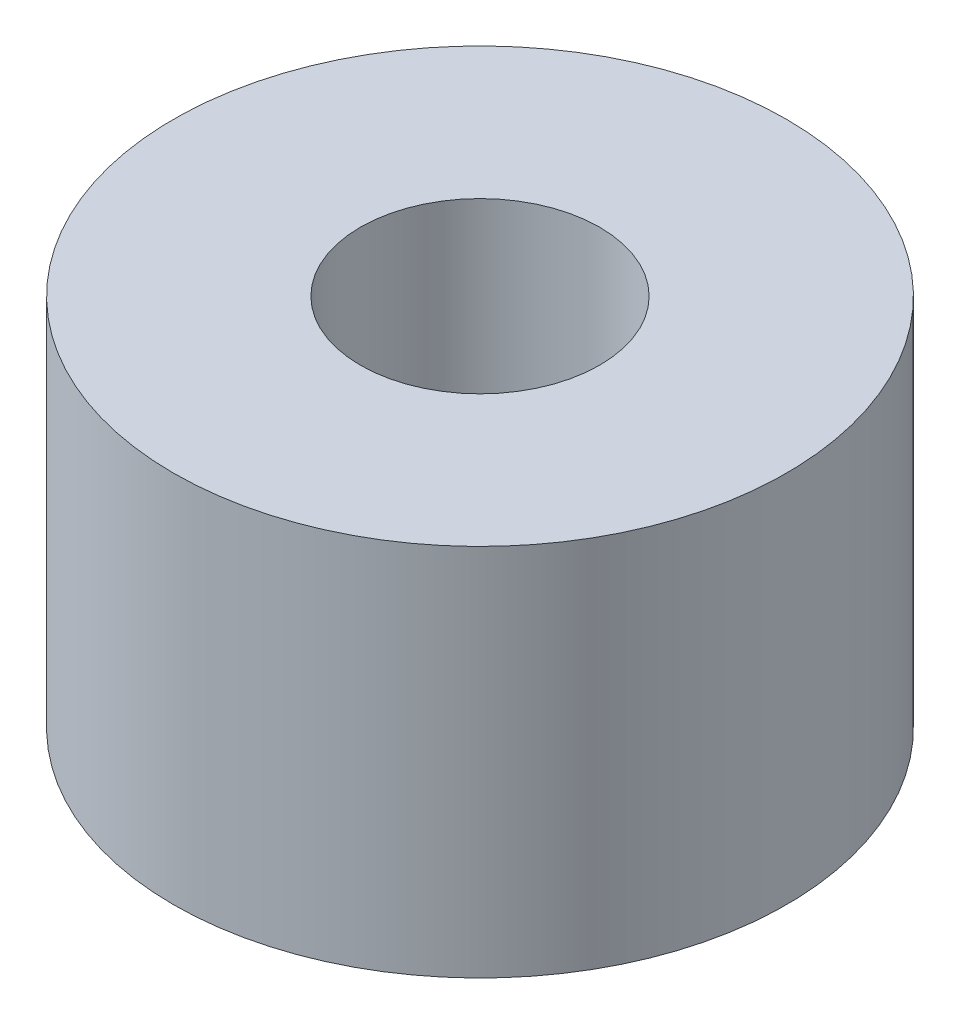
ISO-10303-21;
HEADER;
FILE_DESCRIPTION(('STEP AP214'),'2;1');
FILE_NAME('part.step','',(''),(''),'','','');
FILE_SCHEMA(('AUTOMOTIVE_DESIGN { 1 0 10303 214 1 1 1 1 }'));
ENDSEC;
DATA;
#1=APPLICATION_CONTEXT('core data for automotive mechanical design processes');
#2=APPLICATION_PROTOCOL_DEFINITION('international standard','automotive_design',2000,#1);
#3=PRODUCT_CONTEXT('',#1,'mechanical');
#4=PRODUCT('Part','Part','',(#3));
#5=PRODUCT_RELATED_PRODUCT_CATEGORY('part','',(#4));
#6=PRODUCT_DEFINITION_FORMATION('','',#4);
#7=PRODUCT_DEFINITION_CONTEXT('part definition',#1,'design');
#8=PRODUCT_DEFINITION('design','',#6,#7);
#9=PRODUCT_DEFINITION_SHAPE('','',#8);
#10=(LENGTH_UNIT() NAMED_UNIT(*) SI_UNIT(.MILLI.,.METRE.));
#11=(NAMED_UNIT(*) PLANE_ANGLE_UNIT() SI_UNIT($,.RADIAN.));
#12=(NAMED_UNIT(*) SI_UNIT($,.STERADIAN.) SOLID_ANGLE_UNIT());
#13=UNCERTAINTY_MEASURE_WITH_UNIT(LENGTH_MEASURE(1.E-05),#10,'distance_accuracy_value','');
#14=(GEOMETRIC_REPRESENTATION_CONTEXT(3) GLOBAL_UNCERTAINTY_ASSIGNED_CONTEXT((#13)) GLOBAL_UNIT_ASSIGNED_CONTEXT((#10,
#11,#12)) REPRESENTATION_CONTEXT('',''));
#15=CARTESIAN_POINT('',(0.,0.,0.));
#16=DIRECTION('',(0.,0.,1.));
#17=DIRECTION('',(1.,0.,0.));
#18=AXIS2_PLACEMENT_3D('',#15,#16,#17);
#19=CARTESIAN_POINT('',(0.,6.35,0.));
#20=DIRECTION('',(0.,1.,0.));
#21=DIRECTION('',(0.,0.,1.));
#22=AXIS2_PLACEMENT_3D('',#19,#20,#21);
#23=PLANE('',#22);
#24=CARTESIAN_POINT('',(0.,6.35,0.));
#25=DIRECTION('',(0.,1.,0.));
#26=DIRECTION('',(0.,0.,1.));
#27=AXIS2_PLACEMENT_3D('',#24,#25,#26);
#28=CIRCLE('',#27,5.207);
#29=CARTESIAN_POINT('',(0.,6.35,5.207));
#30=VERTEX_POINT('',#29);
#31=EDGE_CURVE('E10',#30,#30,#28,.T.);
#32=ORIENTED_EDGE('',*,*,#31,.T.);
#33=EDGE_LOOP('',(#32));
#34=FACE_BOUND('',#33,.T.);
#35=CARTESIAN_POINT('',(0.,6.35,0.));
#36=DIRECTION('',(0.,1.,0.));
#37=DIRECTION('',(0.,0.,1.));
#38=AXIS2_PLACEMENT_3D('',#35,#36,#37);
#39=CIRCLE('',#38,2.032);
#40=CARTESIAN_POINT('',(0.,6.35,2.032));
#41=VERTEX_POINT('',#40);
#42=EDGE_CURVE('E52',#41,#41,#39,.T.);
#43=ORIENTED_EDGE('',*,*,#42,.F.);
#44=EDGE_LOOP('',(#43));
#45=FACE_BOUND('',#44,.T.);
#46=ADVANCED_FACE('F39',(#34,#45),#23,.T.);
#47=CARTESIAN_POINT('',(0.,0.,0.));
#48=DIRECTION('',(0.,1.,0.));
#49=DIRECTION('',(0.,0.,1.));
#50=AXIS2_PLACEMENT_3D('',#47,#48,#49);
#51=PLANE('',#50);
#52=CARTESIAN_POINT('',(0.,0.,0.));
#53=DIRECTION('',(0.,1.,0.));
#54=DIRECTION('',(0.,0.,1.));
#55=AXIS2_PLACEMENT_3D('',#52,#53,#54);
#56=CIRCLE('',#55,5.207);
#57=CARTESIAN_POINT('',(0.,0.,5.207));
#58=VERTEX_POINT('',#57);
#59=EDGE_CURVE('E43',#58,#58,#56,.T.);
#60=ORIENTED_EDGE('',*,*,#59,.F.);
#61=EDGE_LOOP('',(#60));
#62=FACE_BOUND('',#61,.T.);
#63=CARTESIAN_POINT('',(0.,0.,0.));
#64=DIRECTION('',(0.,1.,0.));
#65=DIRECTION('',(0.,0.,1.));
#66=AXIS2_PLACEMENT_3D('',#63,#64,#65);
#67=CIRCLE('',#66,2.032);
#68=CARTESIAN_POINT('',(0.,0.,2.032));
#69=VERTEX_POINT('',#68);
#70=EDGE_CURVE('E54',#69,#69,#67,.T.);
#71=ORIENTED_EDGE('',*,*,#70,.T.);
#72=EDGE_LOOP('',(#71));
#73=FACE_BOUND('',#72,.T.);
#74=ADVANCED_FACE('F66',(#62,#73),#51,.F.);
#75=CARTESIAN_POINT('',(0.,6.35,0.));
#76=DIRECTION('',(0.,-1.,0.));
#77=DIRECTION('',(0.,0.,-1.));
#78=AXIS2_PLACEMENT_3D('',#75,#76,#77);
#79=CYLINDRICAL_SURFACE('',#78,5.207);
#80=ORIENTED_EDGE('',*,*,#31,.F.);
#81=EDGE_LOOP('',(#80));
#82=FACE_BOUND('',#81,.T.);
#83=ORIENTED_EDGE('',*,*,#59,.T.);
#84=EDGE_LOOP('',(#83));
#85=FACE_BOUND('',#84,.T.);
#86=ADVANCED_FACE('F41',(#82,#85),#79,.T.);
#87=CARTESIAN_POINT('',(0.,6.35,0.));
#88=DIRECTION('',(0.,-1.,0.));
#89=DIRECTION('',(0.,0.,-1.));
#90=AXIS2_PLACEMENT_3D('',#87,#88,#89);
#91=CYLINDRICAL_SURFACE('',#90,2.032);
#92=ORIENTED_EDGE('',*,*,#42,.T.);
#93=EDGE_LOOP('',(#92));
#94=FACE_BOUND('',#93,.T.);
#95=ORIENTED_EDGE('',*,*,#70,.F.);
#96=EDGE_LOOP('',(#95));
#97=FACE_BOUND('',#96,.T.);
#98=ADVANCED_FACE('F62',(#94,#97),#91,.F.);
#99=CLOSED_SHELL('',(#46,#74,#86,#98));
#100=MANIFOLD_SOLID_BREP('B2',#99);
#101=ADVANCED_BREP_SHAPE_REPRESENTATION('',(#18,#100),#14);
#102=SHAPE_DEFINITION_REPRESENTATION(#9,#101);
ENDSEC;
END-ISO-10303-21;
